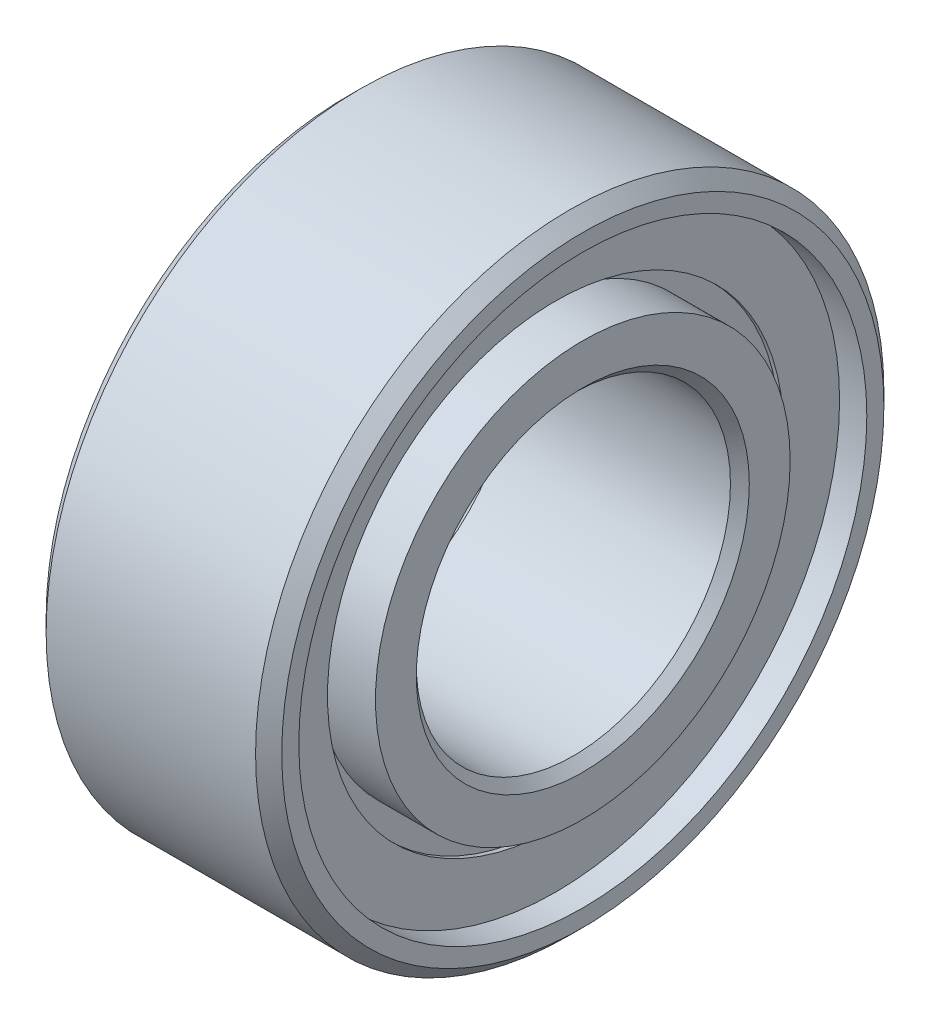
ISO-10303-21;
HEADER;
FILE_DESCRIPTION(('STEP AP214'),'2;1');
FILE_NAME('part.step','',(''),(''),'','','');
FILE_SCHEMA(('AUTOMOTIVE_DESIGN { 1 0 10303 214 1 1 1 1 }'));
ENDSEC;
DATA;
#1=APPLICATION_CONTEXT('core data for automotive mechanical design processes');
#2=APPLICATION_PROTOCOL_DEFINITION('international standard','automotive_design',2000,#1);
#3=PRODUCT_CONTEXT('',#1,'mechanical');
#4=PRODUCT('Part','Part','',(#3));
#5=PRODUCT_RELATED_PRODUCT_CATEGORY('part','',(#4));
#6=PRODUCT_DEFINITION_FORMATION('','',#4);
#7=PRODUCT_DEFINITION_CONTEXT('part definition',#1,'design');
#8=PRODUCT_DEFINITION('design','',#6,#7);
#9=PRODUCT_DEFINITION_SHAPE('','',#8);
#10=(LENGTH_UNIT() NAMED_UNIT(*) SI_UNIT(.MILLI.,.METRE.));
#11=(NAMED_UNIT(*) PLANE_ANGLE_UNIT() SI_UNIT($,.RADIAN.));
#12=(NAMED_UNIT(*) SI_UNIT($,.STERADIAN.) SOLID_ANGLE_UNIT());
#13=UNCERTAINTY_MEASURE_WITH_UNIT(LENGTH_MEASURE(1.E-05),#10,'distance_accuracy_value','');
#14=(GEOMETRIC_REPRESENTATION_CONTEXT(3) GLOBAL_UNCERTAINTY_ASSIGNED_CONTEXT((#13)) GLOBAL_UNIT_ASSIGNED_CONTEXT((#10,
#11,#12)) REPRESENTATION_CONTEXT('',''));
#15=CARTESIAN_POINT('',(0.,0.,0.));
#16=DIRECTION('',(0.,0.,1.));
#17=DIRECTION('',(1.,0.,0.));
#18=AXIS2_PLACEMENT_3D('',#15,#16,#17);
#19=CARTESIAN_POINT('',(-2.38124999992806,4.191,0.));
#20=DIRECTION('',(-1.,0.,0.));
#21=DIRECTION('',(0.,0.,1.));
#22=AXIS2_PLACEMENT_3D('',#19,#20,#21);
#23=PLANE('',#22);
#24=CARTESIAN_POINT('',(-2.38124999992806,0.,0.));
#25=DIRECTION('',(1.,0.,0.));
#26=DIRECTION('',(0.,0.,-1.));
#27=AXIS2_PLACEMENT_3D('',#24,#25,#26);
#28=CIRCLE('',#27,3.36550000002944);
#29=CARTESIAN_POINT('',(-2.38124999992806,0.,-3.36550000002944));
#30=VERTEX_POINT('',#29);
#31=EDGE_CURVE('E10',#30,#30,#28,.T.);
#32=ORIENTED_EDGE('',*,*,#31,.T.);
#33=EDGE_LOOP('',(#32));
#34=FACE_BOUND('',#33,.T.);
#35=CARTESIAN_POINT('',(-2.38124999992806,0.,0.));
#36=DIRECTION('',(1.,0.,0.));
#37=DIRECTION('',(0.,0.,-1.));
#38=AXIS2_PLACEMENT_3D('',#35,#36,#37);
#39=CIRCLE('',#38,4.191);
#40=CARTESIAN_POINT('',(-2.38124999992806,0.,-4.191));
#41=VERTEX_POINT('',#40);
#42=EDGE_CURVE('E106',#41,#41,#39,.T.);
#43=ORIENTED_EDGE('',*,*,#42,.F.);
#44=EDGE_LOOP('',(#43));
#45=FACE_BOUND('',#44,.T.);
#46=ADVANCED_FACE('F30',(#34,#45),#23,.T.);
#47=CARTESIAN_POINT('',(-2.38124999992806,0.,0.));
#48=DIRECTION('',(-1.,0.,0.));
#49=DIRECTION('',(0.,0.,1.));
#50=AXIS2_PLACEMENT_3D('',#47,#48,#49);
#51=CONICAL_SURFACE('',#50,3.36550000002944,0.785398163397447);
#52=CARTESIAN_POINT('',(-2.19074999992586,0.,0.));
#53=DIRECTION('',(1.,0.,0.));
#54=DIRECTION('',(0.,0.,-1.));
#55=AXIS2_PLACEMENT_3D('',#52,#53,#54);
#56=CIRCLE('',#55,3.17500000002724);
#57=CARTESIAN_POINT('',(-2.19074999992586,0.,-3.17500000002724));
#58=VERTEX_POINT('',#57);
#59=EDGE_CURVE('E36',#58,#58,#56,.T.);
#60=ORIENTED_EDGE('',*,*,#59,.T.);
#61=EDGE_LOOP('',(#60));
#62=FACE_BOUND('',#61,.T.);
#63=ORIENTED_EDGE('',*,*,#31,.F.);
#64=EDGE_LOOP('',(#63));
#65=FACE_BOUND('',#64,.T.);
#66=ADVANCED_FACE('F114',(#62,#65),#51,.F.);
#67=CARTESIAN_POINT('',(-2.38125,0.,0.));
#68=DIRECTION('',(1.,0.,0.));
#69=DIRECTION('',(0.,0.,-1.));
#70=AXIS2_PLACEMENT_3D('',#67,#68,#69);
#71=CYLINDRICAL_SURFACE('',#70,3.17500000002724);
#72=CARTESIAN_POINT('',(2.1907499999827,0.,0.));
#73=DIRECTION('',(1.,0.,0.));
#74=DIRECTION('',(0.,0.,-1.));
#75=AXIS2_PLACEMENT_3D('',#72,#73,#74);
#76=CIRCLE('',#75,3.17500000002724);
#77=CARTESIAN_POINT('',(2.1907499999827,0.,-3.17500000002724));
#78=VERTEX_POINT('',#77);
#79=EDGE_CURVE('E40',#78,#78,#76,.T.);
#80=ORIENTED_EDGE('',*,*,#79,.T.);
#81=EDGE_LOOP('',(#80));
#82=FACE_BOUND('',#81,.T.);
#83=ORIENTED_EDGE('',*,*,#59,.F.);
#84=EDGE_LOOP('',(#83));
#85=FACE_BOUND('',#84,.T.);
#86=ADVANCED_FACE('F118',(#82,#85),#71,.F.);
#87=CARTESIAN_POINT('',(2.1907499999827,0.,0.));
#88=DIRECTION('',(1.,0.,0.));
#89=DIRECTION('',(0.,0.,-1.));
#90=AXIS2_PLACEMENT_3D('',#87,#88,#89);
#91=CONICAL_SURFACE('',#90,3.17500000002724,0.785398163397448);
#92=CARTESIAN_POINT('',(2.3812499999849,0.,0.));
#93=DIRECTION('',(1.,0.,0.));
#94=DIRECTION('',(0.,0.,-1.));
#95=AXIS2_PLACEMENT_3D('',#92,#93,#94);
#96=CIRCLE('',#95,3.36550000002944);
#97=CARTESIAN_POINT('',(2.3812499999849,0.,-3.36550000002944));
#98=VERTEX_POINT('',#97);
#99=EDGE_CURVE('E44',#98,#98,#96,.T.);
#100=ORIENTED_EDGE('',*,*,#99,.T.);
#101=EDGE_LOOP('',(#100));
#102=FACE_BOUND('',#101,.T.);
#103=ORIENTED_EDGE('',*,*,#79,.F.);
#104=EDGE_LOOP('',(#103));
#105=FACE_BOUND('',#104,.T.);
#106=ADVANCED_FACE('F122',(#102,#105),#91,.F.);
#107=CARTESIAN_POINT('',(2.3812499999849,3.36550000002944,0.));
#108=DIRECTION('',(1.,0.,0.));
#109=DIRECTION('',(0.,0.,-1.));
#110=AXIS2_PLACEMENT_3D('',#107,#108,#109);
#111=PLANE('',#110);
#112=CARTESIAN_POINT('',(2.3812499999849,0.,0.));
#113=DIRECTION('',(1.,0.,0.));
#114=DIRECTION('',(0.,0.,-1.));
#115=AXIS2_PLACEMENT_3D('',#112,#113,#114);
#116=CIRCLE('',#115,4.191);
#117=CARTESIAN_POINT('',(2.3812499999849,0.,-4.191));
#118=VERTEX_POINT('',#117);
#119=EDGE_CURVE('E49',#118,#118,#116,.T.);
#120=ORIENTED_EDGE('',*,*,#119,.T.);
#121=EDGE_LOOP('',(#120));
#122=FACE_BOUND('',#121,.T.);
#123=ORIENTED_EDGE('',*,*,#99,.F.);
#124=EDGE_LOOP('',(#123));
#125=FACE_BOUND('',#124,.T.);
#126=ADVANCED_FACE('F129',(#122,#125),#111,.T.);
#127=CARTESIAN_POINT('',(-2.38125,0.,0.));
#128=DIRECTION('',(1.,0.,0.));
#129=DIRECTION('',(0.,0.,-1.));
#130=AXIS2_PLACEMENT_3D('',#127,#128,#129);
#131=CYLINDRICAL_SURFACE('',#130,4.191);
#132=CARTESIAN_POINT('',(1.19062500007194,0.,0.));
#133=DIRECTION('',(1.,0.,0.));
#134=DIRECTION('',(0.,0.,-1.));
#135=AXIS2_PLACEMENT_3D('',#132,#133,#134);
#136=CIRCLE('',#135,4.191);
#137=CARTESIAN_POINT('',(1.19062500007194,0.,-4.191));
#138=VERTEX_POINT('',#137);
#139=EDGE_CURVE('E52',#138,#138,#136,.T.);
#140=ORIENTED_EDGE('',*,*,#139,.T.);
#141=EDGE_LOOP('',(#140));
#142=FACE_BOUND('',#141,.T.);
#143=ORIENTED_EDGE('',*,*,#119,.F.);
#144=EDGE_LOOP('',(#143));
#145=FACE_BOUND('',#144,.T.);
#146=ADVANCED_FACE('F133',(#142,#145),#131,.T.);
#147=CARTESIAN_POINT('',(1.19062500007194,4.191,0.));
#148=DIRECTION('',(1.,0.,0.));
#149=DIRECTION('',(0.,0.,-1.));
#150=AXIS2_PLACEMENT_3D('',#147,#148,#149);
#151=PLANE('',#150);
#152=CARTESIAN_POINT('',(1.19062500007194,0.,0.));
#153=DIRECTION('',(1.,0.,0.));
#154=DIRECTION('',(0.,0.,-1.));
#155=AXIS2_PLACEMENT_3D('',#152,#153,#154);
#156=CIRCLE('',#155,5.7404);
#157=CARTESIAN_POINT('',(1.19062500007194,0.,-5.7404));
#158=VERTEX_POINT('',#157);
#159=EDGE_CURVE('E55',#158,#158,#156,.T.);
#160=ORIENTED_EDGE('',*,*,#159,.T.);
#161=EDGE_LOOP('',(#160));
#162=FACE_BOUND('',#161,.T.);
#163=ORIENTED_EDGE('',*,*,#139,.F.);
#164=EDGE_LOOP('',(#163));
#165=FACE_BOUND('',#164,.T.);
#166=ADVANCED_FACE('F137',(#162,#165),#151,.T.);
#167=CARTESIAN_POINT('',(-2.38125,0.,0.));
#168=DIRECTION('',(1.,0.,0.));
#169=DIRECTION('',(0.,0.,-1.));
#170=AXIS2_PLACEMENT_3D('',#167,#168,#169);
#171=CYLINDRICAL_SURFACE('',#170,5.7404);
#172=CARTESIAN_POINT('',(1.74128906257194,0.,0.));
#173=DIRECTION('',(1.,0.,0.));
#174=DIRECTION('',(0.,0.,-1.));
#175=AXIS2_PLACEMENT_3D('',#172,#173,#174);
#176=CIRCLE('',#175,5.7404);
#177=CARTESIAN_POINT('',(1.74128906257194,0.,-5.7404));
#178=VERTEX_POINT('',#177);
#179=EDGE_CURVE('E58',#178,#178,#176,.T.);
#180=ORIENTED_EDGE('',*,*,#179,.T.);
#181=EDGE_LOOP('',(#180));
#182=FACE_BOUND('',#181,.T.);
#183=ORIENTED_EDGE('',*,*,#159,.F.);
#184=EDGE_LOOP('',(#183));
#185=FACE_BOUND('',#184,.T.);
#186=ADVANCED_FACE('F141',(#182,#185),#171,.F.);
#187=CARTESIAN_POINT('',(1.74128906257194,5.7404,0.));
#188=DIRECTION('',(-1.,0.,0.));
#189=DIRECTION('',(0.,0.,1.));
#190=AXIS2_PLACEMENT_3D('',#187,#188,#189);
#191=PLANE('',#190);
#192=CARTESIAN_POINT('',(1.74128906257194,0.,0.));
#193=DIRECTION('',(1.,0.,0.));
#194=DIRECTION('',(0.,0.,-1.));
#195=AXIS2_PLACEMENT_3D('',#192,#193,#194);
#196=CIRCLE('',#195,4.6101);
#197=CARTESIAN_POINT('',(1.74128906257194,0.,-4.6101));
#198=VERTEX_POINT('',#197);
#199=EDGE_CURVE('E61',#198,#198,#196,.T.);
#200=ORIENTED_EDGE('',*,*,#199,.T.);
#201=EDGE_LOOP('',(#200));
#202=FACE_BOUND('',#201,.T.);
#203=ORIENTED_EDGE('',*,*,#179,.F.);
#204=EDGE_LOOP('',(#203));
#205=FACE_BOUND('',#204,.T.);
#206=ADVANCED_FACE('F145',(#202,#205),#191,.T.);
#207=CARTESIAN_POINT('',(-2.38125,0.,0.));
#208=DIRECTION('',(1.,0.,0.));
#209=DIRECTION('',(0.,0.,-1.));
#210=AXIS2_PLACEMENT_3D('',#207,#208,#209);
#211=CYLINDRICAL_SURFACE('',#210,4.6101);
#212=CARTESIAN_POINT('',(1.83058593757194,0.,0.));
#213=DIRECTION('',(1.,0.,0.));
#214=DIRECTION('',(0.,0.,-1.));
#215=AXIS2_PLACEMENT_3D('',#212,#213,#214);
#216=CIRCLE('',#215,4.6101);
#217=CARTESIAN_POINT('',(1.83058593757194,0.,-4.6101));
#218=VERTEX_POINT('',#217);
#219=EDGE_CURVE('E64',#218,#218,#216,.T.);
#220=ORIENTED_EDGE('',*,*,#219,.T.);
#221=EDGE_LOOP('',(#220));
#222=FACE_BOUND('',#221,.T.);
#223=ORIENTED_EDGE('',*,*,#199,.F.);
#224=EDGE_LOOP('',(#223));
#225=FACE_BOUND('',#224,.T.);
#226=ADVANCED_FACE('F149',(#222,#225),#211,.F.);
#227=CARTESIAN_POINT('',(1.83058593757194,4.6101,0.));
#228=DIRECTION('',(1.,0.,0.));
#229=DIRECTION('',(0.,0.,-1.));
#230=AXIS2_PLACEMENT_3D('',#227,#228,#229);
#231=PLANE('',#230);
#232=CARTESIAN_POINT('',(1.83058593757194,0.,0.));
#233=DIRECTION('',(1.,0.,0.));
#234=DIRECTION('',(0.,0.,-1.));
#235=AXIS2_PLACEMENT_3D('',#232,#233,#234);
#236=CIRCLE('',#235,5.7404);
#237=CARTESIAN_POINT('',(1.83058593757194,0.,-5.7404));
#238=VERTEX_POINT('',#237);
#239=EDGE_CURVE('E67',#238,#238,#236,.T.);
#240=ORIENTED_EDGE('',*,*,#239,.T.);
#241=EDGE_LOOP('',(#240));
#242=FACE_BOUND('',#241,.T.);
#243=ORIENTED_EDGE('',*,*,#219,.F.);
#244=EDGE_LOOP('',(#243));
#245=FACE_BOUND('',#244,.T.);
#246=ADVANCED_FACE('F153',(#242,#245),#231,.T.);
#247=CARTESIAN_POINT('',(-2.38125,0.,0.));
#248=DIRECTION('',(1.,0.,0.));
#249=DIRECTION('',(0.,0.,-1.));
#250=AXIS2_PLACEMENT_3D('',#247,#248,#249);
#251=CYLINDRICAL_SURFACE('',#250,5.7404);
#252=CARTESIAN_POINT('',(2.3812499999849,0.,0.));
#253=DIRECTION('',(1.,0.,0.));
#254=DIRECTION('',(0.,0.,-1.));
#255=AXIS2_PLACEMENT_3D('',#252,#253,#254);
#256=CIRCLE('',#255,5.7404);
#257=CARTESIAN_POINT('',(2.3812499999849,0.,-5.7404));
#258=VERTEX_POINT('',#257);
#259=EDGE_CURVE('E70',#258,#258,#256,.T.);
#260=ORIENTED_EDGE('',*,*,#259,.T.);
#261=EDGE_LOOP('',(#260));
#262=FACE_BOUND('',#261,.T.);
#263=ORIENTED_EDGE('',*,*,#239,.F.);
#264=EDGE_LOOP('',(#263));
#265=FACE_BOUND('',#264,.T.);
#266=ADVANCED_FACE('F157',(#262,#265),#251,.F.);
#267=CARTESIAN_POINT('',(2.3812499999849,5.7404,0.));
#268=DIRECTION('',(1.,0.,0.));
#269=DIRECTION('',(0.,0.,-1.));
#270=AXIS2_PLACEMENT_3D('',#267,#268,#269);
#271=PLANE('',#270);
#272=CARTESIAN_POINT('',(2.3812499999849,0.,0.));
#273=DIRECTION('',(1.,0.,0.));
#274=DIRECTION('',(0.,0.,-1.));
#275=AXIS2_PLACEMENT_3D('',#272,#273,#274);
#276=CIRCLE('',#275,6.08541666667861);
#277=CARTESIAN_POINT('',(2.3812499999849,0.,-6.08541666667861));
#278=VERTEX_POINT('',#277);
#279=EDGE_CURVE('E73',#278,#278,#276,.T.);
#280=ORIENTED_EDGE('',*,*,#279,.T.);
#281=EDGE_LOOP('',(#280));
#282=FACE_BOUND('',#281,.T.);
#283=ORIENTED_EDGE('',*,*,#259,.F.);
#284=EDGE_LOOP('',(#283));
#285=FACE_BOUND('',#284,.T.);
#286=ADVANCED_FACE('F161',(#282,#285),#271,.T.);
#287=CARTESIAN_POINT('',(2.3812499999849,0.,0.));
#288=DIRECTION('',(-1.,0.,0.));
#289=DIRECTION('',(0.,0.,1.));
#290=AXIS2_PLACEMENT_3D('',#287,#288,#289);
#291=CONICAL_SURFACE('',#290,6.08541666667861,0.785398163510665);
#292=CARTESIAN_POINT('',(2.11666666672496,0.,0.));
#293=DIRECTION('',(1.,0.,0.));
#294=DIRECTION('',(0.,0.,-1.));
#295=AXIS2_PLACEMENT_3D('',#292,#293,#294);
#296=CIRCLE('',#295,6.34999999999847);
#297=CARTESIAN_POINT('',(2.11666666672496,0.,-6.34999999999847));
#298=VERTEX_POINT('',#297);
#299=EDGE_CURVE('E76',#298,#298,#296,.T.);
#300=ORIENTED_EDGE('',*,*,#299,.T.);
#301=EDGE_LOOP('',(#300));
#302=FACE_BOUND('',#301,.T.);
#303=ORIENTED_EDGE('',*,*,#279,.F.);
#304=EDGE_LOOP('',(#303));
#305=FACE_BOUND('',#304,.T.);
#306=ADVANCED_FACE('F165',(#302,#305),#291,.T.);
#307=CARTESIAN_POINT('',(-2.38125,0.,0.));
#308=DIRECTION('',(1.,0.,0.));
#309=DIRECTION('',(0.,0.,-1.));
#310=AXIS2_PLACEMENT_3D('',#307,#308,#309);
#311=CYLINDRICAL_SURFACE('',#310,6.34999999999847);
#312=CARTESIAN_POINT('',(-2.11666666660821,0.,0.));
#313=DIRECTION('',(1.,0.,0.));
#314=DIRECTION('',(0.,0.,-1.));
#315=AXIS2_PLACEMENT_3D('',#312,#313,#314);
#316=CIRCLE('',#315,6.34999999999847);
#317=CARTESIAN_POINT('',(-2.11666666660821,0.,-6.34999999999847));
#318=VERTEX_POINT('',#317);
#319=EDGE_CURVE('E79',#318,#318,#316,.T.);
#320=ORIENTED_EDGE('',*,*,#319,.T.);
#321=EDGE_LOOP('',(#320));
#322=FACE_BOUND('',#321,.T.);
#323=ORIENTED_EDGE('',*,*,#299,.F.);
#324=EDGE_LOOP('',(#323));
#325=FACE_BOUND('',#324,.T.);
#326=ADVANCED_FACE('F169',(#322,#325),#311,.T.);
#327=CARTESIAN_POINT('',(-2.11666666660821,0.,0.));
#328=DIRECTION('',(1.,0.,0.));
#329=DIRECTION('',(0.,0.,-1.));
#330=AXIS2_PLACEMENT_3D('',#327,#328,#329);
#331=CONICAL_SURFACE('',#330,6.34999999999847,0.785398163397449);
#332=CARTESIAN_POINT('',(-2.38124999992806,0.,0.));
#333=DIRECTION('',(1.,0.,0.));
#334=DIRECTION('',(0.,0.,-1.));
#335=AXIS2_PLACEMENT_3D('',#332,#333,#334);
#336=CIRCLE('',#335,6.08541666667861);
#337=CARTESIAN_POINT('',(-2.38124999992806,0.,-6.08541666667861));
#338=VERTEX_POINT('',#337);
#339=EDGE_CURVE('E82',#338,#338,#336,.T.);
#340=ORIENTED_EDGE('',*,*,#339,.T.);
#341=EDGE_LOOP('',(#340));
#342=FACE_BOUND('',#341,.T.);
#343=ORIENTED_EDGE('',*,*,#319,.F.);
#344=EDGE_LOOP('',(#343));
#345=FACE_BOUND('',#344,.T.);
#346=ADVANCED_FACE('F173',(#342,#345),#331,.T.);
#347=CARTESIAN_POINT('',(-2.38124999992806,6.08541666667861,0.));
#348=DIRECTION('',(-1.,0.,0.));
#349=DIRECTION('',(0.,0.,1.));
#350=AXIS2_PLACEMENT_3D('',#347,#348,#349);
#351=PLANE('',#350);
#352=CARTESIAN_POINT('',(-2.38124999992806,0.,0.));
#353=DIRECTION('',(1.,0.,0.));
#354=DIRECTION('',(0.,0.,-1.));
#355=AXIS2_PLACEMENT_3D('',#352,#353,#354);
#356=CIRCLE('',#355,5.7404);
#357=CARTESIAN_POINT('',(-2.38124999992806,0.,-5.7404));
#358=VERTEX_POINT('',#357);
#359=EDGE_CURVE('E85',#358,#358,#356,.T.);
#360=ORIENTED_EDGE('',*,*,#359,.T.);
#361=EDGE_LOOP('',(#360));
#362=FACE_BOUND('',#361,.T.);
#363=ORIENTED_EDGE('',*,*,#339,.F.);
#364=EDGE_LOOP('',(#363));
#365=FACE_BOUND('',#364,.T.);
#366=ADVANCED_FACE('F177',(#362,#365),#351,.T.);
#367=CARTESIAN_POINT('',(-2.38125,0.,0.));
#368=DIRECTION('',(1.,0.,0.));
#369=DIRECTION('',(0.,0.,-1.));
#370=AXIS2_PLACEMENT_3D('',#367,#368,#369);
#371=CYLINDRICAL_SURFACE('',#370,5.7404);
#372=CARTESIAN_POINT('',(-1.83058593742806,0.,0.));
#373=DIRECTION('',(1.,0.,0.));
#374=DIRECTION('',(0.,0.,-1.));
#375=AXIS2_PLACEMENT_3D('',#372,#373,#374);
#376=CIRCLE('',#375,5.7404);
#377=CARTESIAN_POINT('',(-1.83058593742806,0.,-5.7404));
#378=VERTEX_POINT('',#377);
#379=EDGE_CURVE('E88',#378,#378,#376,.T.);
#380=ORIENTED_EDGE('',*,*,#379,.T.);
#381=EDGE_LOOP('',(#380));
#382=FACE_BOUND('',#381,.T.);
#383=ORIENTED_EDGE('',*,*,#359,.F.);
#384=EDGE_LOOP('',(#383));
#385=FACE_BOUND('',#384,.T.);
#386=ADVANCED_FACE('F181',(#382,#385),#371,.F.);
#387=CARTESIAN_POINT('',(-1.83058593742806,5.7404,0.));
#388=DIRECTION('',(-1.,0.,0.));
#389=DIRECTION('',(0.,0.,1.));
#390=AXIS2_PLACEMENT_3D('',#387,#388,#389);
#391=PLANE('',#390);
#392=CARTESIAN_POINT('',(-1.83058593742806,0.,0.));
#393=DIRECTION('',(1.,0.,0.));
#394=DIRECTION('',(0.,0.,-1.));
#395=AXIS2_PLACEMENT_3D('',#392,#393,#394);
#396=CIRCLE('',#395,4.6101);
#397=CARTESIAN_POINT('',(-1.83058593742806,0.,-4.6101));
#398=VERTEX_POINT('',#397);
#399=EDGE_CURVE('E91',#398,#398,#396,.T.);
#400=ORIENTED_EDGE('',*,*,#399,.T.);
#401=EDGE_LOOP('',(#400));
#402=FACE_BOUND('',#401,.T.);
#403=ORIENTED_EDGE('',*,*,#379,.F.);
#404=EDGE_LOOP('',(#403));
#405=FACE_BOUND('',#404,.T.);
#406=ADVANCED_FACE('F185',(#402,#405),#391,.T.);
#407=CARTESIAN_POINT('',(-2.38125,0.,0.));
#408=DIRECTION('',(1.,0.,0.));
#409=DIRECTION('',(0.,0.,-1.));
#410=AXIS2_PLACEMENT_3D('',#407,#408,#409);
#411=CYLINDRICAL_SURFACE('',#410,4.6101);
#412=CARTESIAN_POINT('',(-1.74128906242806,0.,0.));
#413=DIRECTION('',(1.,0.,0.));
#414=DIRECTION('',(0.,0.,-1.));
#415=AXIS2_PLACEMENT_3D('',#412,#413,#414);
#416=CIRCLE('',#415,4.6101);
#417=CARTESIAN_POINT('',(-1.74128906242806,0.,-4.6101));
#418=VERTEX_POINT('',#417);
#419=EDGE_CURVE('E94',#418,#418,#416,.T.);
#420=ORIENTED_EDGE('',*,*,#419,.T.);
#421=EDGE_LOOP('',(#420));
#422=FACE_BOUND('',#421,.T.);
#423=ORIENTED_EDGE('',*,*,#399,.F.);
#424=EDGE_LOOP('',(#423));
#425=FACE_BOUND('',#424,.T.);
#426=ADVANCED_FACE('F189',(#422,#425),#411,.F.);
#427=CARTESIAN_POINT('',(-1.74128906242806,4.6101,0.));
#428=DIRECTION('',(1.,0.,0.));
#429=DIRECTION('',(0.,0.,-1.));
#430=AXIS2_PLACEMENT_3D('',#427,#428,#429);
#431=PLANE('',#430);
#432=CARTESIAN_POINT('',(-1.74128906242806,0.,0.));
#433=DIRECTION('',(1.,0.,0.));
#434=DIRECTION('',(0.,0.,-1.));
#435=AXIS2_PLACEMENT_3D('',#432,#433,#434);
#436=CIRCLE('',#435,5.7404);
#437=CARTESIAN_POINT('',(-1.74128906242806,0.,-5.7404));
#438=VERTEX_POINT('',#437);
#439=EDGE_CURVE('E97',#438,#438,#436,.T.);
#440=ORIENTED_EDGE('',*,*,#439,.T.);
#441=EDGE_LOOP('',(#440));
#442=FACE_BOUND('',#441,.T.);
#443=ORIENTED_EDGE('',*,*,#419,.F.);
#444=EDGE_LOOP('',(#443));
#445=FACE_BOUND('',#444,.T.);
#446=ADVANCED_FACE('F193',(#442,#445),#431,.T.);
#447=CARTESIAN_POINT('',(-2.38125,0.,0.));
#448=DIRECTION('',(1.,0.,0.));
#449=DIRECTION('',(0.,0.,-1.));
#450=AXIS2_PLACEMENT_3D('',#447,#448,#449);
#451=CYLINDRICAL_SURFACE('',#450,5.7404);
#452=CARTESIAN_POINT('',(-1.19062499992806,0.,0.));
#453=DIRECTION('',(1.,0.,0.));
#454=DIRECTION('',(0.,0.,-1.));
#455=AXIS2_PLACEMENT_3D('',#452,#453,#454);
#456=CIRCLE('',#455,5.7404);
#457=CARTESIAN_POINT('',(-1.19062499992806,0.,-5.7404));
#458=VERTEX_POINT('',#457);
#459=EDGE_CURVE('E100',#458,#458,#456,.T.);
#460=ORIENTED_EDGE('',*,*,#459,.T.);
#461=EDGE_LOOP('',(#460));
#462=FACE_BOUND('',#461,.T.);
#463=ORIENTED_EDGE('',*,*,#439,.F.);
#464=EDGE_LOOP('',(#463));
#465=FACE_BOUND('',#464,.T.);
#466=ADVANCED_FACE('F197',(#462,#465),#451,.F.);
#467=CARTESIAN_POINT('',(-1.19062499992806,5.7404,0.));
#468=DIRECTION('',(-1.,0.,0.));
#469=DIRECTION('',(0.,0.,1.));
#470=AXIS2_PLACEMENT_3D('',#467,#468,#469);
#471=PLANE('',#470);
#472=CARTESIAN_POINT('',(-1.19062499992806,0.,0.));
#473=DIRECTION('',(1.,0.,0.));
#474=DIRECTION('',(0.,0.,-1.));
#475=AXIS2_PLACEMENT_3D('',#472,#473,#474);
#476=CIRCLE('',#475,4.191);
#477=CARTESIAN_POINT('',(-1.19062499992806,0.,-4.191));
#478=VERTEX_POINT('',#477);
#479=EDGE_CURVE('E103',#478,#478,#476,.T.);
#480=ORIENTED_EDGE('',*,*,#479,.T.);
#481=EDGE_LOOP('',(#480));
#482=FACE_BOUND('',#481,.T.);
#483=ORIENTED_EDGE('',*,*,#459,.F.);
#484=EDGE_LOOP('',(#483));
#485=FACE_BOUND('',#484,.T.);
#486=ADVANCED_FACE('F201',(#482,#485),#471,.T.);
#487=CARTESIAN_POINT('',(-2.38125,0.,0.));
#488=DIRECTION('',(1.,0.,0.));
#489=DIRECTION('',(0.,0.,-1.));
#490=AXIS2_PLACEMENT_3D('',#487,#488,#489);
#491=CYLINDRICAL_SURFACE('',#490,4.191);
#492=ORIENTED_EDGE('',*,*,#42,.T.);
#493=EDGE_LOOP('',(#492));
#494=FACE_BOUND('',#493,.T.);
#495=ORIENTED_EDGE('',*,*,#479,.F.);
#496=EDGE_LOOP('',(#495));
#497=FACE_BOUND('',#496,.T.);
#498=ADVANCED_FACE('F110',(#494,#497),#491,.T.);
#499=CLOSED_SHELL('',(#46,#66,#86,#106,#126,#146,#166,#186,#206,#226,#246,#266,#286,#306,#326,
#346,#366,#386,#406,#426,#446,#466,#486,#498));
#500=MANIFOLD_SOLID_BREP('B2',#499);
#501=ADVANCED_BREP_SHAPE_REPRESENTATION('',(#18,#500),#14);
#502=SHAPE_DEFINITION_REPRESENTATION(#9,#501);
ENDSEC;
END-ISO-10303-21;
